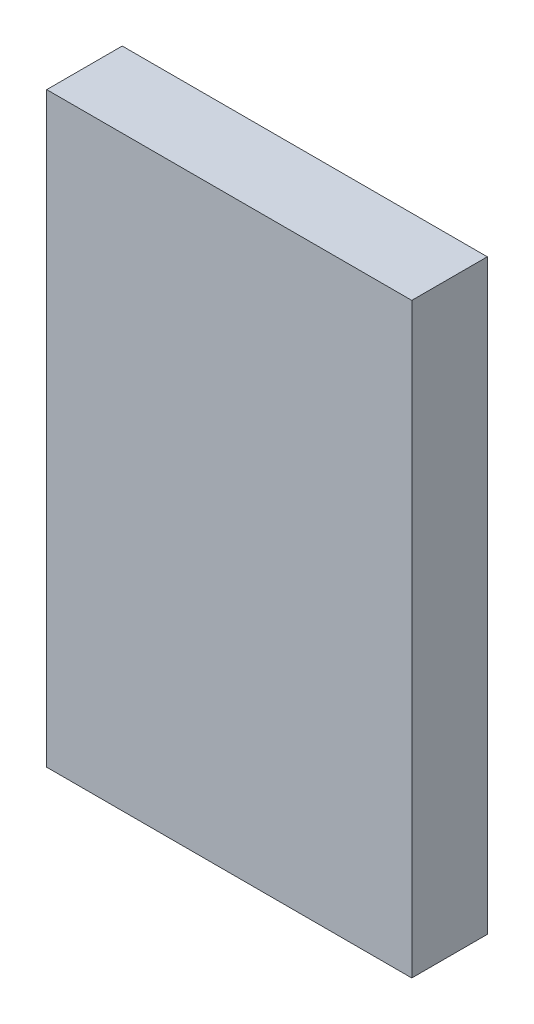
ISO-10303-21;
HEADER;
FILE_DESCRIPTION(('STEP AP214'),'2;1');
FILE_NAME('part.step','',(''),(''),'','','');
FILE_SCHEMA(('AUTOMOTIVE_DESIGN { 1 0 10303 214 1 1 1 1 }'));
ENDSEC;
DATA;
#1=APPLICATION_CONTEXT('core data for automotive mechanical design processes');
#2=APPLICATION_PROTOCOL_DEFINITION('international standard','automotive_design',2000,#1);
#3=PRODUCT_CONTEXT('',#1,'mechanical');
#4=PRODUCT('Part','Part','',(#3));
#5=PRODUCT_RELATED_PRODUCT_CATEGORY('part','',(#4));
#6=PRODUCT_DEFINITION_FORMATION('','',#4);
#7=PRODUCT_DEFINITION_CONTEXT('part definition',#1,'design');
#8=PRODUCT_DEFINITION('design','',#6,#7);
#9=PRODUCT_DEFINITION_SHAPE('','',#8);
#10=(LENGTH_UNIT() NAMED_UNIT(*) SI_UNIT(.MILLI.,.METRE.));
#11=(NAMED_UNIT(*) PLANE_ANGLE_UNIT() SI_UNIT($,.RADIAN.));
#12=(NAMED_UNIT(*) SI_UNIT($,.STERADIAN.) SOLID_ANGLE_UNIT());
#13=UNCERTAINTY_MEASURE_WITH_UNIT(LENGTH_MEASURE(1.E-05),#10,'distance_accuracy_value','');
#14=(GEOMETRIC_REPRESENTATION_CONTEXT(3) GLOBAL_UNCERTAINTY_ASSIGNED_CONTEXT((#13)) GLOBAL_UNIT_ASSIGNED_CONTEXT((#10,
#11,#12)) REPRESENTATION_CONTEXT('',''));
#15=CARTESIAN_POINT('',(0.,0.,0.));
#16=DIRECTION('',(0.,0.,1.));
#17=DIRECTION('',(1.,0.,0.));
#18=AXIS2_PLACEMENT_3D('',#15,#16,#17);
#19=CARTESIAN_POINT('',(-7.2064311680698,-7.13058560659967,3.));
#20=DIRECTION('',(1.,0.,0.));
#21=DIRECTION('',(0.,1.,0.));
#22=AXIS2_PLACEMENT_3D('',#19,#20,#21);
#23=PLANE('',#22);
#24=DIRECTION('',(0.,-1.,0.));
#25=VECTOR('',#24,1.);
#26=CARTESIAN_POINT('',(-7.2064311680698,-7.13058560659967,0.));
#27=LINE('',#26,#25);
#28=CARTESIAN_POINT('',(-7.2064311680698,13.3694143934003,0.));
#29=VERTEX_POINT('',#28);
#30=CARTESIAN_POINT('',(-7.20643116806979,-9.93968540221812,0.));
#31=VERTEX_POINT('',#30);
#32=EDGE_CURVE('E76',#29,#31,#27,.T.);
#33=ORIENTED_EDGE('',*,*,#32,.T.);
#34=DIRECTION('',(0.,0.,-1.));
#35=VECTOR('',#34,1.);
#36=CARTESIAN_POINT('',(-7.20643116806979,-9.93968540221812,3.));
#37=LINE('',#36,#35);
#38=CARTESIAN_POINT('',(-7.20643116806979,-9.93968540221812,3.));
#39=VERTEX_POINT('',#38);
#40=EDGE_CURVE('E11',#39,#31,#37,.T.);
#41=ORIENTED_EDGE('',*,*,#40,.F.);
#42=DIRECTION('',(0.,1.,0.));
#43=VECTOR('',#42,1.);
#44=CARTESIAN_POINT('',(-7.2064311680698,-7.13058560659967,3.));
#45=LINE('',#44,#43);
#46=CARTESIAN_POINT('',(-7.2064311680698,13.3694143934003,3.));
#47=VERTEX_POINT('',#46);
#48=EDGE_CURVE('E55',#39,#47,#45,.T.);
#49=ORIENTED_EDGE('',*,*,#48,.T.);
#50=DIRECTION('',(0.,0.,-1.));
#51=VECTOR('',#50,1.);
#52=CARTESIAN_POINT('',(-7.2064311680698,13.3694143934003,3.));
#53=LINE('',#52,#51);
#54=EDGE_CURVE('E40',#47,#29,#53,.T.);
#55=ORIENTED_EDGE('',*,*,#54,.T.);
#56=EDGE_LOOP('',(#33,#41,#49,#55));
#57=FACE_BOUND('',#56,.T.);
#58=ADVANCED_FACE('F36',(#57),#23,.F.);
#59=CARTESIAN_POINT('',(-7.20643116806979,-9.93968540221812,3.));
#60=DIRECTION('',(0.,1.,0.));
#61=DIRECTION('',(-1.,0.,0.));
#62=AXIS2_PLACEMENT_3D('',#59,#60,#61);
#63=PLANE('',#62);
#64=DIRECTION('',(1.,0.,0.));
#65=VECTOR('',#64,1.);
#66=CARTESIAN_POINT('',(-7.20643116806979,-9.93968540221812,0.));
#67=LINE('',#66,#65);
#68=CARTESIAN_POINT('',(7.29356883193021,-9.93968540221812,0.));
#69=VERTEX_POINT('',#68);
#70=EDGE_CURVE('E103',#31,#69,#67,.T.);
#71=ORIENTED_EDGE('',*,*,#70,.T.);
#72=DIRECTION('',(0.,0.,-1.));
#73=VECTOR('',#72,1.);
#74=CARTESIAN_POINT('',(7.29356883193021,-9.93968540221812,3.));
#75=LINE('',#74,#73);
#76=CARTESIAN_POINT('',(7.29356883193021,-9.93968540221812,3.));
#77=VERTEX_POINT('',#76);
#78=EDGE_CURVE('E46',#77,#69,#75,.T.);
#79=ORIENTED_EDGE('',*,*,#78,.F.);
#80=DIRECTION('',(1.,0.,0.));
#81=VECTOR('',#80,1.);
#82=CARTESIAN_POINT('',(-7.20643116806979,-9.93968540221812,3.));
#83=LINE('',#82,#81);
#84=EDGE_CURVE('E88',#39,#77,#83,.T.);
#85=ORIENTED_EDGE('',*,*,#84,.F.);
#86=ORIENTED_EDGE('',*,*,#40,.T.);
#87=EDGE_LOOP('',(#71,#79,#85,#86));
#88=FACE_BOUND('',#87,.T.);
#89=ADVANCED_FACE('F108',(#88),#63,.F.);
#90=CARTESIAN_POINT('',(7.29356883193021,-6.93968540221812,3.));
#91=DIRECTION('',(1.,0.,0.));
#92=DIRECTION('',(0.,1.,0.));
#93=AXIS2_PLACEMENT_3D('',#90,#91,#92);
#94=PLANE('',#93);
#95=DIRECTION('',(0.,-1.,0.));
#96=VECTOR('',#95,1.);
#97=CARTESIAN_POINT('',(7.29356883193021,-6.93968540221812,0.));
#98=LINE('',#97,#96);
#99=CARTESIAN_POINT('',(7.2935688319302,13.3694143934003,0.));
#100=VERTEX_POINT('',#99);
#101=EDGE_CURVE('E94',#100,#69,#98,.T.);
#102=ORIENTED_EDGE('',*,*,#101,.F.);
#103=DIRECTION('',(0.,0.,-1.));
#104=VECTOR('',#103,1.);
#105=CARTESIAN_POINT('',(7.2935688319302,13.3694143934003,3.));
#106=LINE('',#105,#104);
#107=CARTESIAN_POINT('',(7.2935688319302,13.3694143934003,3.));
#108=VERTEX_POINT('',#107);
#109=EDGE_CURVE('E91',#108,#100,#106,.T.);
#110=ORIENTED_EDGE('',*,*,#109,.F.);
#111=DIRECTION('',(0.,1.,0.));
#112=VECTOR('',#111,1.);
#113=CARTESIAN_POINT('',(7.29356883193021,-6.93968540221812,3.));
#114=LINE('',#113,#112);
#115=EDGE_CURVE('E83',#77,#108,#114,.T.);
#116=ORIENTED_EDGE('',*,*,#115,.F.);
#117=ORIENTED_EDGE('',*,*,#78,.T.);
#118=EDGE_LOOP('',(#102,#110,#116,#117));
#119=FACE_BOUND('',#118,.T.);
#120=ADVANCED_FACE('F92',(#119),#94,.T.);
#121=CARTESIAN_POINT('',(-7.2064311680698,13.3694143934003,3.));
#122=DIRECTION('',(0.,1.,0.));
#123=DIRECTION('',(-1.,0.,0.));
#124=AXIS2_PLACEMENT_3D('',#121,#122,#123);
#125=PLANE('',#124);
#126=DIRECTION('',(1.,0.,0.));
#127=VECTOR('',#126,1.);
#128=CARTESIAN_POINT('',(-7.2064311680698,13.3694143934003,0.));
#129=LINE('',#128,#127);
#130=EDGE_CURVE('E100',#29,#100,#129,.T.);
#131=ORIENTED_EDGE('',*,*,#130,.F.);
#132=ORIENTED_EDGE('',*,*,#54,.F.);
#133=DIRECTION('',(1.,0.,0.));
#134=VECTOR('',#133,1.);
#135=CARTESIAN_POINT('',(-7.2064311680698,13.3694143934003,3.));
#136=LINE('',#135,#134);
#137=EDGE_CURVE('E86',#47,#108,#136,.T.);
#138=ORIENTED_EDGE('',*,*,#137,.T.);
#139=ORIENTED_EDGE('',*,*,#109,.T.);
#140=EDGE_LOOP('',(#131,#132,#138,#139));
#141=FACE_BOUND('',#140,.T.);
#142=ADVANCED_FACE('F38',(#141),#125,.T.);
#143=CARTESIAN_POINT('',(0.,0.,3.));
#144=DIRECTION('',(0.,0.,-1.));
#145=DIRECTION('',(-1.,0.,0.));
#146=AXIS2_PLACEMENT_3D('',#143,#144,#145);
#147=PLANE('',#146);
#148=ORIENTED_EDGE('',*,*,#48,.F.);
#149=ORIENTED_EDGE('',*,*,#84,.T.);
#150=ORIENTED_EDGE('',*,*,#115,.T.);
#151=ORIENTED_EDGE('',*,*,#137,.F.);
#152=EDGE_LOOP('',(#148,#149,#150,#151));
#153=FACE_BOUND('',#152,.T.);
#154=ADVANCED_FACE('F85',(#153),#147,.F.);
#155=CARTESIAN_POINT('',(0.,0.,0.));
#156=DIRECTION('',(0.,0.,-1.));
#157=DIRECTION('',(-1.,0.,0.));
#158=AXIS2_PLACEMENT_3D('',#155,#156,#157);
#159=PLANE('',#158);
#160=ORIENTED_EDGE('',*,*,#32,.F.);
#161=ORIENTED_EDGE('',*,*,#130,.T.);
#162=ORIENTED_EDGE('',*,*,#101,.T.);
#163=ORIENTED_EDGE('',*,*,#70,.F.);
#164=EDGE_LOOP('',(#160,#161,#162,#163));
#165=FACE_BOUND('',#164,.T.);
#166=ADVANCED_FACE('F110',(#165),#159,.T.);
#167=CLOSED_SHELL('',(#58,#89,#120,#142,#154,#166));
#168=MANIFOLD_SOLID_BREP('B2',#167);
#169=ADVANCED_BREP_SHAPE_REPRESENTATION('',(#18,#168),#14);
#170=SHAPE_DEFINITION_REPRESENTATION(#9,#169);
ENDSEC;
END-ISO-10303-21;
